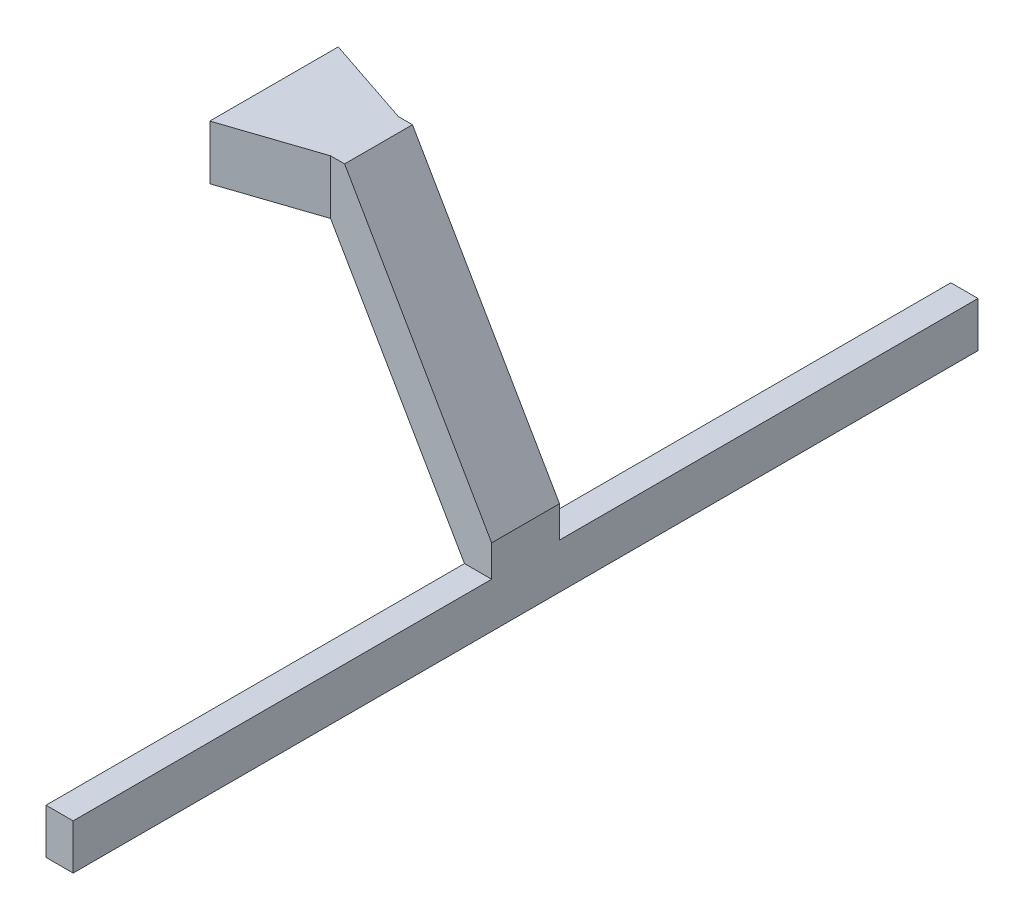
ISO-10303-21;
HEADER;
FILE_DESCRIPTION(('STEP AP214'),'2;1');
FILE_NAME('part.step','',(''),(''),'','','');
FILE_SCHEMA(('AUTOMOTIVE_DESIGN { 1 0 10303 214 1 1 1 1 }'));
ENDSEC;
DATA;
#1=APPLICATION_CONTEXT('core data for automotive mechanical design processes');
#2=APPLICATION_PROTOCOL_DEFINITION('international standard','automotive_design',2000,#1);
#3=PRODUCT_CONTEXT('',#1,'mechanical');
#4=PRODUCT('Part','Part','',(#3));
#5=PRODUCT_RELATED_PRODUCT_CATEGORY('part','',(#4));
#6=PRODUCT_DEFINITION_FORMATION('','',#4);
#7=PRODUCT_DEFINITION_CONTEXT('part definition',#1,'design');
#8=PRODUCT_DEFINITION('design','',#6,#7);
#9=PRODUCT_DEFINITION_SHAPE('','',#8);
#10=(LENGTH_UNIT() NAMED_UNIT(*) SI_UNIT(.MILLI.,.METRE.));
#11=(NAMED_UNIT(*) PLANE_ANGLE_UNIT() SI_UNIT($,.RADIAN.));
#12=(NAMED_UNIT(*) SI_UNIT($,.STERADIAN.) SOLID_ANGLE_UNIT());
#13=UNCERTAINTY_MEASURE_WITH_UNIT(LENGTH_MEASURE(1.E-05),#10,'distance_accuracy_value','');
#14=(GEOMETRIC_REPRESENTATION_CONTEXT(3) GLOBAL_UNCERTAINTY_ASSIGNED_CONTEXT((#13)) GLOBAL_UNIT_ASSIGNED_CONTEXT((#10,
#11,#12)) REPRESENTATION_CONTEXT('',''));
#15=CARTESIAN_POINT('',(0.,0.,0.));
#16=DIRECTION('',(0.,0.,1.));
#17=DIRECTION('',(1.,0.,0.));
#18=AXIS2_PLACEMENT_3D('',#15,#16,#17);
#19=CARTESIAN_POINT('',(-29.9025484433055,3.22370443988916,15.));
#20=DIRECTION('',(1.,0.,0.));
#21=DIRECTION('',(0.,0.,-1.));
#22=AXIS2_PLACEMENT_3D('',#19,#20,#21);
#23=PLANE('',#22);
#24=DIRECTION('',(0.,0.,-1.));
#25=VECTOR('',#24,1.);
#26=CARTESIAN_POINT('',(-29.9025484433055,15.2237044398892,15.));
#27=LINE('',#26,#25);
#28=CARTESIAN_POINT('',(-29.9025484433055,15.2237044398892,21.7025547028879));
#29=VERTEX_POINT('',#28);
#30=CARTESIAN_POINT('',(-29.9025484433055,15.2237044398892,-6.69239480134588));
#31=VERTEX_POINT('',#30);
#32=EDGE_CURVE('E170',#29,#31,#27,.T.);
#33=ORIENTED_EDGE('',*,*,#32,.T.);
#34=DIRECTION('',(0.,1.,0.));
#35=VECTOR('',#34,1.);
#36=CARTESIAN_POINT('',(-29.9025484433055,3.22370443988915,-6.69239480134588));
#37=LINE('',#36,#35);
#38=CARTESIAN_POINT('',(-29.9025484433055,3.22370443988915,-6.69239480134588));
#39=VERTEX_POINT('',#38);
#40=EDGE_CURVE('E132',#39,#31,#37,.T.);
#41=ORIENTED_EDGE('',*,*,#40,.F.);
#42=DIRECTION('',(0.,0.,-1.));
#43=VECTOR('',#42,1.);
#44=CARTESIAN_POINT('',(-29.9025484433055,3.22370443988916,15.));
#45=LINE('',#44,#43);
#46=CARTESIAN_POINT('',(-29.9025484433055,3.22370443988915,21.7025547028879));
#47=VERTEX_POINT('',#46);
#48=EDGE_CURVE('E40',#47,#39,#45,.T.);
#49=ORIENTED_EDGE('',*,*,#48,.F.);
#50=DIRECTION('',(0.,1.,0.));
#51=VECTOR('',#50,1.);
#52=CARTESIAN_POINT('',(-29.9025484433055,3.22370443988915,21.7025547028879));
#53=LINE('',#52,#51);
#54=EDGE_CURVE('E220',#47,#29,#53,.T.);
#55=ORIENTED_EDGE('',*,*,#54,.T.);
#56=EDGE_LOOP('',(#33,#41,#49,#55));
#57=FACE_BOUND('',#56,.T.);
#58=ADVANCED_FACE('F33',(#57),#23,.F.);
#59=CARTESIAN_POINT('',(-9.89582205568276,3.22370443988915,15.));
#60=DIRECTION('',(0.,1.,0.));
#61=DIRECTION('',(-1.,0.,0.));
#62=AXIS2_PLACEMENT_3D('',#59,#60,#61);
#63=PLANE('',#62);
#64=ORIENTED_EDGE('',*,*,#48,.T.);
#65=DIRECTION('',(-0.94834878740458,0.,-0.317229534293803));
#66=VECTOR('',#65,1.);
#67=CARTESIAN_POINT('',(-9.89582205568276,3.22370443988915,0.));
#68=LINE('',#67,#66);
#69=CARTESIAN_POINT('',(-9.89582205568276,3.22370443988915,0.));
#70=VERTEX_POINT('',#69);
#71=EDGE_CURVE('E125',#70,#39,#68,.T.);
#72=ORIENTED_EDGE('',*,*,#71,.F.);
#73=DIRECTION('',(0.,0.,-1.));
#74=VECTOR('',#73,1.);
#75=CARTESIAN_POINT('',(-9.89582205568276,3.22370443988915,15.));
#76=LINE('',#75,#74);
#77=CARTESIAN_POINT('',(-9.89582205568276,3.22370443988915,15.));
#78=VERTEX_POINT('',#77);
#79=EDGE_CURVE('E139',#78,#70,#76,.T.);
#80=ORIENTED_EDGE('',*,*,#79,.F.);
#81=DIRECTION('',(0.948203825724986,0.,-0.317662564493365));
#82=VECTOR('',#81,1.);
#83=CARTESIAN_POINT('',(-9.89582205568276,3.22370443988915,15.));
#84=LINE('',#83,#82);
#85=EDGE_CURVE('E218',#47,#78,#84,.T.);
#86=ORIENTED_EDGE('',*,*,#85,.F.);
#87=EDGE_LOOP('',(#64,#72,#80,#86));
#88=FACE_BOUND('',#87,.T.);
#89=ADVANCED_FACE('F137',(#88),#63,.F.);
#90=CARTESIAN_POINT('',(19.6974515566944,-48.0333490190357,15.));
#91=DIRECTION('',(0.86602540378444,0.499999999999998,0.));
#92=DIRECTION('',(-0.499999999999998,0.86602540378444,0.));
#93=AXIS2_PLACEMENT_3D('',#90,#91,#92);
#94=PLANE('',#93);
#95=DIRECTION('',(0.499999999999998,-0.86602540378444,0.));
#96=VECTOR('',#95,1.);
#97=CARTESIAN_POINT('',(19.6974515566944,-48.0333490190357,0.));
#98=LINE('',#97,#96);
#99=CARTESIAN_POINT('',(19.6974515566945,-48.0333490190357,0.));
#100=VERTEX_POINT('',#99);
#101=EDGE_CURVE('E147',#70,#100,#98,.T.);
#102=ORIENTED_EDGE('',*,*,#101,.T.);
#103=DIRECTION('',(0.,0.,-1.));
#104=VECTOR('',#103,1.);
#105=CARTESIAN_POINT('',(19.6974515566944,-48.0333490190357,15.));
#106=LINE('',#105,#104);
#107=CARTESIAN_POINT('',(19.6974515566944,-48.0333490190357,15.));
#108=VERTEX_POINT('',#107);
#109=EDGE_CURVE('E151',#108,#100,#106,.T.);
#110=ORIENTED_EDGE('',*,*,#109,.F.);
#111=DIRECTION('',(0.499999999999998,-0.86602540378444,0.));
#112=VECTOR('',#111,1.);
#113=CARTESIAN_POINT('',(19.6974515566944,-48.0333490190357,15.));
#114=LINE('',#113,#112);
#115=EDGE_CURVE('E149',#78,#108,#114,.T.);
#116=ORIENTED_EDGE('',*,*,#115,.F.);
#117=ORIENTED_EDGE('',*,*,#79,.T.);
#118=EDGE_LOOP('',(#102,#110,#116,#117));
#119=FACE_BOUND('',#118,.T.);
#120=ADVANCED_FACE('F145',(#119),#94,.F.);
#121=CARTESIAN_POINT('',(19.6974515566944,-58.0333490190357,15.));
#122=DIRECTION('',(1.,0.,0.));
#123=DIRECTION('',(0.,1.,0.));
#124=AXIS2_PLACEMENT_3D('',#121,#122,#123);
#125=PLANE('',#124);
#126=ORIENTED_EDGE('',*,*,#109,.T.);
#127=DIRECTION('',(0.,0.,1.));
#128=VECTOR('',#127,1.);
#129=CARTESIAN_POINT('',(19.6974515566945,-48.0333490190357,107.5));
#130=LINE('',#129,#128);
#131=CARTESIAN_POINT('',(19.6974515566945,-48.0333490190357,-92.5));
#132=VERTEX_POINT('',#131);
#133=EDGE_CURVE('E187',#132,#100,#130,.T.);
#134=ORIENTED_EDGE('',*,*,#133,.F.);
#135=DIRECTION('',(0.,1.,0.));
#136=VECTOR('',#135,1.);
#137=CARTESIAN_POINT('',(19.6974515566945,-48.0333490190357,-92.5));
#138=LINE('',#137,#136);
#139=CARTESIAN_POINT('',(19.6974515566945,-58.0333490190357,-92.5));
#140=VERTEX_POINT('',#139);
#141=EDGE_CURVE('E230',#140,#132,#138,.T.);
#142=ORIENTED_EDGE('',*,*,#141,.F.);
#143=DIRECTION('',(0.,0.,-1.));
#144=VECTOR('',#143,1.);
#145=CARTESIAN_POINT('',(19.6974515566944,-58.0333490190357,15.));
#146=LINE('',#145,#144);
#147=CARTESIAN_POINT('',(19.6974515566945,-58.0333490190357,107.5));
#148=VERTEX_POINT('',#147);
#149=EDGE_CURVE('E180',#148,#140,#146,.T.);
#150=ORIENTED_EDGE('',*,*,#149,.F.);
#151=DIRECTION('',(0.,-1.,0.));
#152=VECTOR('',#151,1.);
#153=CARTESIAN_POINT('',(19.6974515566945,-48.0333490190357,107.5));
#154=LINE('',#153,#152);
#155=CARTESIAN_POINT('',(19.6974515566945,-48.0333490190357,107.5));
#156=VERTEX_POINT('',#155);
#157=EDGE_CURVE('E227',#156,#148,#154,.T.);
#158=ORIENTED_EDGE('',*,*,#157,.F.);
#159=EDGE_CURVE('E189',#108,#156,#130,.T.);
#160=ORIENTED_EDGE('',*,*,#159,.F.);
#161=EDGE_LOOP('',(#126,#134,#142,#150,#158,#160));
#162=FACE_BOUND('',#161,.T.);
#163=ADVANCED_FACE('F185',(#162),#125,.F.);
#164=CARTESIAN_POINT('',(25.6974515566944,-58.0333490190357,15.));
#165=DIRECTION('',(0.,1.,0.));
#166=DIRECTION('',(-1.,0.,0.));
#167=AXIS2_PLACEMENT_3D('',#164,#165,#166);
#168=PLANE('',#167);
#169=ORIENTED_EDGE('',*,*,#149,.T.);
#170=DIRECTION('',(1.,0.,0.));
#171=VECTOR('',#170,1.);
#172=CARTESIAN_POINT('',(19.6974515566945,-58.0333490190357,-92.5));
#173=LINE('',#172,#171);
#174=CARTESIAN_POINT('',(25.6974515566945,-58.0333490190357,-92.5));
#175=VERTEX_POINT('',#174);
#176=EDGE_CURVE('E243',#140,#175,#173,.T.);
#177=ORIENTED_EDGE('',*,*,#176,.T.);
#178=DIRECTION('',(0.,0.,-1.));
#179=VECTOR('',#178,1.);
#180=CARTESIAN_POINT('',(25.6974515566944,-58.0333490190357,15.));
#181=LINE('',#180,#179);
#182=CARTESIAN_POINT('',(25.6974515566945,-58.0333490190357,107.5));
#183=VERTEX_POINT('',#182);
#184=EDGE_CURVE('E178',#183,#175,#181,.T.);
#185=ORIENTED_EDGE('',*,*,#184,.F.);
#186=DIRECTION('',(1.,0.,0.));
#187=VECTOR('',#186,1.);
#188=CARTESIAN_POINT('',(19.6974515566945,-58.0333490190357,107.5));
#189=LINE('',#188,#187);
#190=EDGE_CURVE('E234',#148,#183,#189,.T.);
#191=ORIENTED_EDGE('',*,*,#190,.F.);
#192=EDGE_LOOP('',(#169,#177,#185,#191));
#193=FACE_BOUND('',#192,.T.);
#194=ADVANCED_FACE('F253',(#193),#168,.F.);
#195=CARTESIAN_POINT('',(25.6974515566944,-41.0679468060994,15.));
#196=DIRECTION('',(-1.,0.,0.));
#197=DIRECTION('',(0.,-1.,0.));
#198=AXIS2_PLACEMENT_3D('',#195,#196,#197);
#199=PLANE('',#198);
#200=DIRECTION('',(0.,1.,0.));
#201=VECTOR('',#200,1.);
#202=CARTESIAN_POINT('',(25.6974515566944,-41.0679468060994,15.));
#203=LINE('',#202,#201);
#204=CARTESIAN_POINT('',(25.6974515566945,-48.0333490190357,15.));
#205=VERTEX_POINT('',#204);
#206=CARTESIAN_POINT('',(25.6974515566944,-41.0679468060994,15.));
#207=VERTEX_POINT('',#206);
#208=EDGE_CURVE('E198',#205,#207,#203,.T.);
#209=ORIENTED_EDGE('',*,*,#208,.F.);
#210=DIRECTION('',(0.,0.,1.));
#211=VECTOR('',#210,1.);
#212=CARTESIAN_POINT('',(25.6974515566945,-48.0333490190357,107.5));
#213=LINE('',#212,#211);
#214=CARTESIAN_POINT('',(25.6974515566945,-48.0333490190357,107.5));
#215=VERTEX_POINT('',#214);
#216=EDGE_CURVE('E196',#205,#215,#213,.T.);
#217=ORIENTED_EDGE('',*,*,#216,.T.);
#218=DIRECTION('',(0.,-1.,0.));
#219=VECTOR('',#218,1.);
#220=CARTESIAN_POINT('',(25.6974515566945,-48.0333490190357,107.5));
#221=LINE('',#220,#219);
#222=EDGE_CURVE('E225',#215,#183,#221,.T.);
#223=ORIENTED_EDGE('',*,*,#222,.T.);
#224=ORIENTED_EDGE('',*,*,#184,.T.);
#225=DIRECTION('',(0.,1.,0.));
#226=VECTOR('',#225,1.);
#227=CARTESIAN_POINT('',(25.6974515566945,-48.0333490190357,-92.5));
#228=LINE('',#227,#226);
#229=CARTESIAN_POINT('',(25.6974515566945,-48.0333490190357,-92.5));
#230=VERTEX_POINT('',#229);
#231=EDGE_CURVE('E237',#175,#230,#228,.T.);
#232=ORIENTED_EDGE('',*,*,#231,.T.);
#233=CARTESIAN_POINT('',(25.6974515566944,-48.0333490190357,0.));
#234=VERTEX_POINT('',#233);
#235=EDGE_CURVE('E55',#230,#234,#213,.T.);
#236=ORIENTED_EDGE('',*,*,#235,.T.);
#237=DIRECTION('',(0.,1.,0.));
#238=VECTOR('',#237,1.);
#239=CARTESIAN_POINT('',(25.6974515566944,-41.0679468060994,0.));
#240=LINE('',#239,#238);
#241=CARTESIAN_POINT('',(25.6974515566944,-41.0679468060994,0.));
#242=VERTEX_POINT('',#241);
#243=EDGE_CURVE('E156',#234,#242,#240,.T.);
#244=ORIENTED_EDGE('',*,*,#243,.T.);
#245=DIRECTION('',(0.,0.,-1.));
#246=VECTOR('',#245,1.);
#247=CARTESIAN_POINT('',(25.6974515566944,-41.0679468060994,15.));
#248=LINE('',#247,#246);
#249=EDGE_CURVE('E175',#207,#242,#248,.T.);
#250=ORIENTED_EDGE('',*,*,#249,.F.);
#251=EDGE_LOOP('',(#209,#217,#223,#224,#232,#236,#244,#250));
#252=FACE_BOUND('',#251,.T.);
#253=ADVANCED_FACE('F251',(#252),#199,.F.);
#254=CARTESIAN_POINT('',(-6.80254844330545,15.2237044398892,15.));
#255=DIRECTION('',(-0.86602540378444,-0.499999999999998,0.));
#256=DIRECTION('',(0.499999999999998,-0.86602540378444,0.));
#257=AXIS2_PLACEMENT_3D('',#254,#255,#256);
#258=PLANE('',#257);
#259=DIRECTION('',(-0.499999999999998,0.86602540378444,0.));
#260=VECTOR('',#259,1.);
#261=CARTESIAN_POINT('',(-6.80254844330545,15.2237044398892,0.));
#262=LINE('',#261,#260);
#263=CARTESIAN_POINT('',(-6.80254844330545,15.2237044398892,0.));
#264=VERTEX_POINT('',#263);
#265=EDGE_CURVE('E159',#242,#264,#262,.T.);
#266=ORIENTED_EDGE('',*,*,#265,.T.);
#267=DIRECTION('',(0.,0.,-1.));
#268=VECTOR('',#267,1.);
#269=CARTESIAN_POINT('',(-6.80254844330545,15.2237044398892,15.));
#270=LINE('',#269,#268);
#271=CARTESIAN_POINT('',(-6.80254844330545,15.2237044398892,15.));
#272=VERTEX_POINT('',#271);
#273=EDGE_CURVE('E172',#272,#264,#270,.T.);
#274=ORIENTED_EDGE('',*,*,#273,.F.);
#275=DIRECTION('',(-0.499999999999998,0.86602540378444,0.));
#276=VECTOR('',#275,1.);
#277=CARTESIAN_POINT('',(-6.80254844330545,15.2237044398892,15.));
#278=LINE('',#277,#276);
#279=EDGE_CURVE('E202',#207,#272,#278,.T.);
#280=ORIENTED_EDGE('',*,*,#279,.F.);
#281=ORIENTED_EDGE('',*,*,#249,.T.);
#282=EDGE_LOOP('',(#266,#274,#280,#281));
#283=FACE_BOUND('',#282,.T.);
#284=ADVANCED_FACE('F208',(#283),#258,.F.);
#285=CARTESIAN_POINT('',(-29.9025484433055,15.2237044398892,15.));
#286=DIRECTION('',(0.,-1.,0.));
#287=DIRECTION('',(1.,0.,0.));
#288=AXIS2_PLACEMENT_3D('',#285,#286,#287);
#289=PLANE('',#288);
#290=DIRECTION('',(-1.,0.,0.));
#291=VECTOR('',#290,1.);
#292=CARTESIAN_POINT('',(-29.9025484433055,15.2237044398892,0.));
#293=LINE('',#292,#291);
#294=CARTESIAN_POINT('',(-9.89582205568276,15.2237044398892,0.));
#295=VERTEX_POINT('',#294);
#296=EDGE_CURVE('E168',#264,#295,#293,.T.);
#297=ORIENTED_EDGE('',*,*,#296,.T.);
#298=DIRECTION('',(-0.94834878740458,0.,-0.317229534293803));
#299=VECTOR('',#298,1.);
#300=CARTESIAN_POINT('',(-9.89582205568276,15.2237044398892,0.));
#301=LINE('',#300,#299);
#302=EDGE_CURVE('E127',#295,#31,#301,.T.);
#303=ORIENTED_EDGE('',*,*,#302,.T.);
#304=ORIENTED_EDGE('',*,*,#32,.F.);
#305=DIRECTION('',(0.948203825724986,0.,-0.317662564493365));
#306=VECTOR('',#305,1.);
#307=CARTESIAN_POINT('',(-9.89582205568276,15.2237044398892,15.));
#308=LINE('',#307,#306);
#309=CARTESIAN_POINT('',(-9.89582205568276,15.2237044398892,15.));
#310=VERTEX_POINT('',#309);
#311=EDGE_CURVE('E214',#29,#310,#308,.T.);
#312=ORIENTED_EDGE('',*,*,#311,.T.);
#313=DIRECTION('',(-1.,0.,0.));
#314=VECTOR('',#313,1.);
#315=CARTESIAN_POINT('',(-29.9025484433055,15.2237044398892,15.));
#316=LINE('',#315,#314);
#317=EDGE_CURVE('E47',#272,#310,#316,.T.);
#318=ORIENTED_EDGE('',*,*,#317,.F.);
#319=ORIENTED_EDGE('',*,*,#273,.T.);
#320=EDGE_LOOP('',(#297,#303,#304,#312,#318,#319));
#321=FACE_BOUND('',#320,.T.);
#322=ADVANCED_FACE('F212',(#321),#289,.F.);
#323=CARTESIAN_POINT('',(0.,0.,15.));
#324=DIRECTION('',(0.,0.,-1.));
#325=DIRECTION('',(-1.,0.,0.));
#326=AXIS2_PLACEMENT_3D('',#323,#324,#325);
#327=PLANE('',#326);
#328=ORIENTED_EDGE('',*,*,#317,.T.);
#329=DIRECTION('',(0.,1.,0.));
#330=VECTOR('',#329,1.);
#331=CARTESIAN_POINT('',(-9.89582205568276,3.22370443988915,15.));
#332=LINE('',#331,#330);
#333=EDGE_CURVE('E200',#78,#310,#332,.T.);
#334=ORIENTED_EDGE('',*,*,#333,.F.);
#335=ORIENTED_EDGE('',*,*,#115,.T.);
#336=DIRECTION('',(1.,0.,0.));
#337=VECTOR('',#336,1.);
#338=CARTESIAN_POINT('',(0.,-48.0333490190357,15.));
#339=LINE('',#338,#337);
#340=EDGE_CURVE('E157',#108,#205,#339,.T.);
#341=ORIENTED_EDGE('',*,*,#340,.T.);
#342=ORIENTED_EDGE('',*,*,#208,.T.);
#343=ORIENTED_EDGE('',*,*,#279,.T.);
#344=EDGE_LOOP('',(#328,#334,#335,#341,#342,#343));
#345=FACE_BOUND('',#344,.T.);
#346=ADVANCED_FACE('F197',(#345),#327,.F.);
#347=CARTESIAN_POINT('',(0.,0.,0.));
#348=DIRECTION('',(0.,0.,-1.));
#349=DIRECTION('',(-1.,0.,0.));
#350=AXIS2_PLACEMENT_3D('',#347,#348,#349);
#351=PLANE('',#350);
#352=DIRECTION('',(0.,1.,0.));
#353=VECTOR('',#352,1.);
#354=CARTESIAN_POINT('',(-9.89582205568276,3.22370443988915,0.));
#355=LINE('',#354,#353);
#356=EDGE_CURVE('E121',#70,#295,#355,.T.);
#357=ORIENTED_EDGE('',*,*,#356,.T.);
#358=ORIENTED_EDGE('',*,*,#296,.F.);
#359=ORIENTED_EDGE('',*,*,#265,.F.);
#360=ORIENTED_EDGE('',*,*,#243,.F.);
#361=DIRECTION('',(1.,0.,0.));
#362=VECTOR('',#361,1.);
#363=CARTESIAN_POINT('',(0.,-48.0333490190357,0.));
#364=LINE('',#363,#362);
#365=EDGE_CURVE('E11',#100,#234,#364,.T.);
#366=ORIENTED_EDGE('',*,*,#365,.F.);
#367=ORIENTED_EDGE('',*,*,#101,.F.);
#368=EDGE_LOOP('',(#357,#358,#359,#360,#366,#367));
#369=FACE_BOUND('',#368,.T.);
#370=ADVANCED_FACE('F154',(#369),#351,.T.);
#371=CARTESIAN_POINT('',(19.6974515566945,-48.0333490190357,-92.5));
#372=DIRECTION('',(0.,0.,-1.));
#373=DIRECTION('',(-1.,0.,0.));
#374=AXIS2_PLACEMENT_3D('',#371,#372,#373);
#375=PLANE('',#374);
#376=ORIENTED_EDGE('',*,*,#231,.F.);
#377=ORIENTED_EDGE('',*,*,#176,.F.);
#378=ORIENTED_EDGE('',*,*,#141,.T.);
#379=DIRECTION('',(1.,0.,0.));
#380=VECTOR('',#379,1.);
#381=CARTESIAN_POINT('',(19.6974515566945,-48.0333490190357,-92.5));
#382=LINE('',#381,#380);
#383=EDGE_CURVE('E241',#132,#230,#382,.T.);
#384=ORIENTED_EDGE('',*,*,#383,.T.);
#385=EDGE_LOOP('',(#376,#377,#378,#384));
#386=FACE_BOUND('',#385,.T.);
#387=ADVANCED_FACE('F256',(#386),#375,.T.);
#388=CARTESIAN_POINT('',(19.6974515566945,-48.0333490190357,107.5));
#389=DIRECTION('',(0.,1.,0.));
#390=DIRECTION('',(0.,0.,1.));
#391=AXIS2_PLACEMENT_3D('',#388,#389,#390);
#392=PLANE('',#391);
#393=ORIENTED_EDGE('',*,*,#133,.T.);
#394=ORIENTED_EDGE('',*,*,#365,.T.);
#395=ORIENTED_EDGE('',*,*,#235,.F.);
#396=ORIENTED_EDGE('',*,*,#383,.F.);
#397=EDGE_LOOP('',(#393,#394,#395,#396));
#398=FACE_BOUND('',#397,.T.);
#399=ADVANCED_FACE('F258',(#398),#392,.T.);
#400=ORIENTED_EDGE('',*,*,#340,.F.);
#401=ORIENTED_EDGE('',*,*,#159,.T.);
#402=DIRECTION('',(1.,0.,0.));
#403=VECTOR('',#402,1.);
#404=CARTESIAN_POINT('',(19.6974515566945,-48.0333490190357,107.5));
#405=LINE('',#404,#403);
#406=EDGE_CURVE('E162',#156,#215,#405,.T.);
#407=ORIENTED_EDGE('',*,*,#406,.T.);
#408=ORIENTED_EDGE('',*,*,#216,.F.);
#409=EDGE_LOOP('',(#400,#401,#407,#408));
#410=FACE_BOUND('',#409,.T.);
#411=ADVANCED_FACE('F193',(#410),#392,.T.);
#412=CARTESIAN_POINT('',(19.6974515566945,-48.0333490190357,107.5));
#413=DIRECTION('',(0.,0.,1.));
#414=DIRECTION('',(1.,0.,0.));
#415=AXIS2_PLACEMENT_3D('',#412,#413,#414);
#416=PLANE('',#415);
#417=ORIENTED_EDGE('',*,*,#222,.F.);
#418=ORIENTED_EDGE('',*,*,#406,.F.);
#419=ORIENTED_EDGE('',*,*,#157,.T.);
#420=ORIENTED_EDGE('',*,*,#190,.T.);
#421=EDGE_LOOP('',(#417,#418,#419,#420));
#422=FACE_BOUND('',#421,.T.);
#423=ADVANCED_FACE('F249',(#422),#416,.T.);
#424=CARTESIAN_POINT('',(-9.89582205568276,3.22370443988915,15.));
#425=DIRECTION('',(0.317662564493365,0.,0.948203825724985));
#426=DIRECTION('',(0.948203825724986,0.,-0.317662564493365));
#427=AXIS2_PLACEMENT_3D('',#424,#425,#426);
#428=PLANE('',#427);
#429=ORIENTED_EDGE('',*,*,#311,.F.);
#430=ORIENTED_EDGE('',*,*,#54,.F.);
#431=ORIENTED_EDGE('',*,*,#85,.T.);
#432=ORIENTED_EDGE('',*,*,#333,.T.);
#433=EDGE_LOOP('',(#429,#430,#431,#432));
#434=FACE_BOUND('',#433,.T.);
#435=ADVANCED_FACE('F273',(#434),#428,.T.);
#436=CARTESIAN_POINT('',(-9.89582205568276,3.22370443988915,0.));
#437=DIRECTION('',(0.317229534293803,0.,-0.94834878740458));
#438=DIRECTION('',(-0.94834878740458,0.,-0.317229534293803));
#439=AXIS2_PLACEMENT_3D('',#436,#437,#438);
#440=PLANE('',#439);
#441=ORIENTED_EDGE('',*,*,#302,.F.);
#442=ORIENTED_EDGE('',*,*,#356,.F.);
#443=ORIENTED_EDGE('',*,*,#71,.T.);
#444=ORIENTED_EDGE('',*,*,#40,.T.);
#445=EDGE_LOOP('',(#441,#442,#443,#444));
#446=FACE_BOUND('',#445,.T.);
#447=ADVANCED_FACE('F123',(#446),#440,.T.);
#448=CLOSED_SHELL('',(#58,#89,#120,#163,#194,#253,#284,#322,#346,#370,#387,#399,#411,#423,#435,#447));
#449=MANIFOLD_SOLID_BREP('B2',#448);
#450=ADVANCED_BREP_SHAPE_REPRESENTATION('',(#18,#449),#14);
#451=SHAPE_DEFINITION_REPRESENTATION(#9,#450);
ENDSEC;
END-ISO-10303-21;
